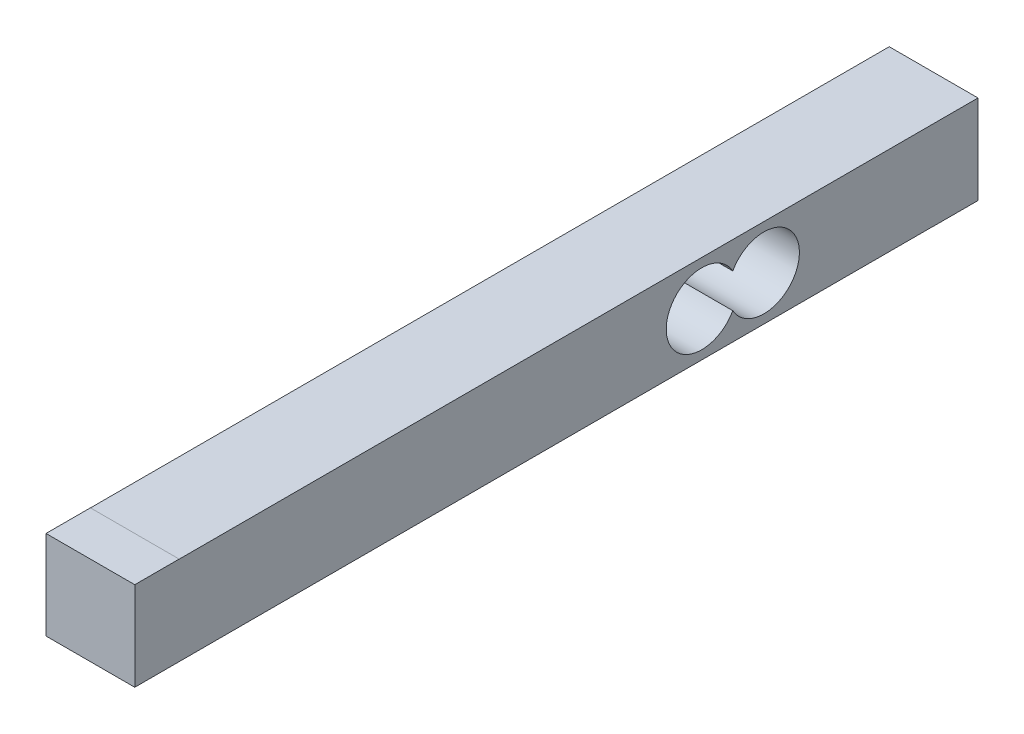
ISO-10303-21;
HEADER;
FILE_DESCRIPTION(('STEP AP214'),'2;1');
FILE_NAME('part.step','',(''),(''),'','','');
FILE_SCHEMA(('AUTOMOTIVE_DESIGN { 1 0 10303 214 1 1 1 1 }'));
ENDSEC;
DATA;
#1=APPLICATION_CONTEXT('core data for automotive mechanical design processes');
#2=APPLICATION_PROTOCOL_DEFINITION('international standard','automotive_design',2000,#1);
#3=PRODUCT_CONTEXT('',#1,'mechanical');
#4=PRODUCT('Part','Part','',(#3));
#5=PRODUCT_RELATED_PRODUCT_CATEGORY('part','',(#4));
#6=PRODUCT_DEFINITION_FORMATION('','',#4);
#7=PRODUCT_DEFINITION_CONTEXT('part definition',#1,'design');
#8=PRODUCT_DEFINITION('design','',#6,#7);
#9=PRODUCT_DEFINITION_SHAPE('','',#8);
#10=(LENGTH_UNIT() NAMED_UNIT(*) SI_UNIT(.MILLI.,.METRE.));
#11=(NAMED_UNIT(*) PLANE_ANGLE_UNIT() SI_UNIT($,.RADIAN.));
#12=(NAMED_UNIT(*) SI_UNIT($,.STERADIAN.) SOLID_ANGLE_UNIT());
#13=UNCERTAINTY_MEASURE_WITH_UNIT(LENGTH_MEASURE(1.E-05),#10,'distance_accuracy_value','');
#14=(GEOMETRIC_REPRESENTATION_CONTEXT(3) GLOBAL_UNCERTAINTY_ASSIGNED_CONTEXT((#13)) GLOBAL_UNIT_ASSIGNED_CONTEXT((#10,
#11,#12)) REPRESENTATION_CONTEXT('',''));
#15=CARTESIAN_POINT('',(0.,0.,0.));
#16=DIRECTION('',(0.,0.,1.));
#17=DIRECTION('',(1.,0.,0.));
#18=AXIS2_PLACEMENT_3D('',#15,#16,#17);
#19=CARTESIAN_POINT('',(-5.,-5.,95.));
#20=DIRECTION('',(0.,1.,0.));
#21=DIRECTION('',(0.,0.,1.));
#22=AXIS2_PLACEMENT_3D('',#19,#20,#21);
#23=PLANE('',#22);
#24=DIRECTION('',(-1.,0.,0.));
#25=VECTOR('',#24,1.);
#26=CARTESIAN_POINT('',(-5.,-5.,5.));
#27=LINE('',#26,#25);
#28=CARTESIAN_POINT('',(5.,-5.,5.));
#29=VERTEX_POINT('',#28);
#30=CARTESIAN_POINT('',(-5.,-5.,5.));
#31=VERTEX_POINT('',#30);
#32=EDGE_CURVE('E134',#29,#31,#27,.T.);
#33=ORIENTED_EDGE('',*,*,#32,.F.);
#34=DIRECTION('',(0.,0.,-1.));
#35=VECTOR('',#34,1.);
#36=CARTESIAN_POINT('',(5.,-5.,95.));
#37=LINE('',#36,#35);
#38=CARTESIAN_POINT('',(5.,-5.,95.));
#39=VERTEX_POINT('',#38);
#40=EDGE_CURVE('E48',#39,#29,#37,.T.);
#41=ORIENTED_EDGE('',*,*,#40,.F.);
#42=DIRECTION('',(1.,0.,0.));
#43=VECTOR('',#42,1.);
#44=CARTESIAN_POINT('',(-5.,-5.,95.));
#45=LINE('',#44,#43);
#46=CARTESIAN_POINT('',(-5.,-5.,95.));
#47=VERTEX_POINT('',#46);
#48=EDGE_CURVE('E188',#47,#39,#45,.T.);
#49=ORIENTED_EDGE('',*,*,#48,.F.);
#50=DIRECTION('',(0.,0.,-1.));
#51=VECTOR('',#50,1.);
#52=CARTESIAN_POINT('',(-5.,-5.,95.));
#53=LINE('',#52,#51);
#54=EDGE_CURVE('E11',#47,#31,#53,.T.);
#55=ORIENTED_EDGE('',*,*,#54,.T.);
#56=EDGE_LOOP('',(#33,#41,#49,#55));
#57=FACE_BOUND('',#56,.T.);
#58=ADVANCED_FACE('F39',(#57),#23,.F.);
#59=CARTESIAN_POINT('',(-5.,5.,95.));
#60=DIRECTION('',(0.,-1.,0.));
#61=DIRECTION('',(1.,0.,0.));
#62=AXIS2_PLACEMENT_3D('',#59,#60,#61);
#63=PLANE('',#62);
#64=DIRECTION('',(-1.,0.,0.));
#65=VECTOR('',#64,1.);
#66=CARTESIAN_POINT('',(-5.,5.,90.));
#67=LINE('',#66,#65);
#68=CARTESIAN_POINT('',(5.,5.,90.));
#69=VERTEX_POINT('',#68);
#70=CARTESIAN_POINT('',(-5.,5.,90.));
#71=VERTEX_POINT('',#70);
#72=EDGE_CURVE('E160',#69,#71,#67,.T.);
#73=ORIENTED_EDGE('',*,*,#72,.F.);
#74=DIRECTION('',(0.,0.,-1.));
#75=VECTOR('',#74,1.);
#76=CARTESIAN_POINT('',(5.,5.,95.));
#77=LINE('',#76,#75);
#78=CARTESIAN_POINT('',(5.,5.,0.));
#79=VERTEX_POINT('',#78);
#80=EDGE_CURVE('E175',#69,#79,#77,.T.);
#81=ORIENTED_EDGE('',*,*,#80,.T.);
#82=DIRECTION('',(-1.,0.,0.));
#83=VECTOR('',#82,1.);
#84=CARTESIAN_POINT('',(-5.,5.,0.));
#85=LINE('',#84,#83);
#86=CARTESIAN_POINT('',(-5.,5.,0.));
#87=VERTEX_POINT('',#86);
#88=EDGE_CURVE('E189',#79,#87,#85,.T.);
#89=ORIENTED_EDGE('',*,*,#88,.T.);
#90=DIRECTION('',(0.,0.,-1.));
#91=VECTOR('',#90,1.);
#92=CARTESIAN_POINT('',(-5.,5.,95.));
#93=LINE('',#92,#91);
#94=EDGE_CURVE('E193',#71,#87,#93,.T.);
#95=ORIENTED_EDGE('',*,*,#94,.F.);
#96=EDGE_LOOP('',(#73,#81,#89,#95));
#97=FACE_BOUND('',#96,.T.);
#98=ADVANCED_FACE('F242',(#97),#63,.F.);
#99=CARTESIAN_POINT('',(-5.,5.,95.));
#100=DIRECTION('',(1.,0.,0.));
#101=DIRECTION('',(0.,1.,0.));
#102=AXIS2_PLACEMENT_3D('',#99,#100,#101);
#103=PLANE('',#102);
#104=CARTESIAN_POINT('',(-5.,-0.00500000000000498,31.125));
#105=DIRECTION('',(1.,0.,0.));
#106=DIRECTION('',(0.,1.,0.));
#107=AXIS2_PLACEMENT_3D('',#104,#105,#106);
#108=CIRCLE('',#107,4.);
#109=CARTESIAN_POINT('',(-5.,1.9314916731037,27.625));
#110=VERTEX_POINT('',#109);
#111=CARTESIAN_POINT('',(-5.,-1.94149167310371,27.625));
#112=VERTEX_POINT('',#111);
#113=EDGE_CURVE('E119',#110,#112,#108,.T.);
#114=ORIENTED_EDGE('',*,*,#113,.T.);
#115=CARTESIAN_POINT('',(-5.,-0.00500000000000376,24.125));
#116=DIRECTION('',(1.,0.,0.));
#117=DIRECTION('',(0.,1.,0.));
#118=AXIS2_PLACEMENT_3D('',#115,#116,#117);
#119=CIRCLE('',#118,4.);
#120=EDGE_CURVE('E117',#112,#110,#119,.T.);
#121=ORIENTED_EDGE('',*,*,#120,.T.);
#122=EDGE_LOOP('',(#114,#121));
#123=FACE_BOUND('',#122,.T.);
#124=DIRECTION('',(0.,-1.,0.));
#125=VECTOR('',#124,1.);
#126=CARTESIAN_POINT('',(-5.,5.,0.));
#127=LINE('',#126,#125);
#128=CARTESIAN_POINT('',(-5.,-5.01,0.));
#129=VERTEX_POINT('',#128);
#130=EDGE_CURVE('E194',#87,#129,#127,.T.);
#131=ORIENTED_EDGE('',*,*,#130,.T.);
#132=DIRECTION('',(0.,0.,-1.));
#133=VECTOR('',#132,1.);
#134=CARTESIAN_POINT('',(-5.,-5.01,0.));
#135=LINE('',#134,#133);
#136=CARTESIAN_POINT('',(-5.,-5.01,5.));
#137=VERTEX_POINT('',#136);
#138=EDGE_CURVE('E135',#137,#129,#135,.T.);
#139=ORIENTED_EDGE('',*,*,#138,.F.);
#140=DIRECTION('',(0.,1.,0.));
#141=VECTOR('',#140,1.);
#142=CARTESIAN_POINT('',(-5.,-5.01,5.));
#143=LINE('',#142,#141);
#144=EDGE_CURVE('E145',#137,#31,#143,.T.);
#145=ORIENTED_EDGE('',*,*,#144,.T.);
#146=ORIENTED_EDGE('',*,*,#54,.F.);
#147=DIRECTION('',(0.,-1.,0.));
#148=VECTOR('',#147,1.);
#149=CARTESIAN_POINT('',(-5.,5.,95.));
#150=LINE('',#149,#148);
#151=CARTESIAN_POINT('',(-5.,5.01,95.));
#152=VERTEX_POINT('',#151);
#153=EDGE_CURVE('E185',#152,#47,#150,.T.);
#154=ORIENTED_EDGE('',*,*,#153,.F.);
#155=DIRECTION('',(0.,0.,1.));
#156=VECTOR('',#155,1.);
#157=CARTESIAN_POINT('',(-5.,5.01,95.));
#158=LINE('',#157,#156);
#159=CARTESIAN_POINT('',(-5.,5.01,90.));
#160=VERTEX_POINT('',#159);
#161=EDGE_CURVE('E148',#160,#152,#158,.T.);
#162=ORIENTED_EDGE('',*,*,#161,.F.);
#163=DIRECTION('',(0.,-1.,0.));
#164=VECTOR('',#163,1.);
#165=CARTESIAN_POINT('',(-5.,5.01,90.));
#166=LINE('',#165,#164);
#167=EDGE_CURVE('E178',#160,#71,#166,.T.);
#168=ORIENTED_EDGE('',*,*,#167,.T.);
#169=ORIENTED_EDGE('',*,*,#94,.T.);
#170=EDGE_LOOP('',(#131,#139,#145,#146,#154,#162,#168,#169));
#171=FACE_BOUND('',#170,.T.);
#172=ADVANCED_FACE('F41',(#123,#171),#103,.F.);
#173=CARTESIAN_POINT('',(5.,5.,95.));
#174=DIRECTION('',(-1.,0.,0.));
#175=DIRECTION('',(0.,-1.,0.));
#176=AXIS2_PLACEMENT_3D('',#173,#174,#175);
#177=PLANE('',#176);
#178=CARTESIAN_POINT('',(5.,-0.00500000000000361,31.125));
#179=DIRECTION('',(1.,0.,0.));
#180=DIRECTION('',(0.,1.,0.));
#181=AXIS2_PLACEMENT_3D('',#178,#179,#180);
#182=CIRCLE('',#181,4.);
#183=CARTESIAN_POINT('',(5.,1.93149167310371,27.625));
#184=VERTEX_POINT('',#183);
#185=CARTESIAN_POINT('',(5.,-1.94149167310371,27.625));
#186=VERTEX_POINT('',#185);
#187=EDGE_CURVE('E123',#184,#186,#182,.T.);
#188=ORIENTED_EDGE('',*,*,#187,.F.);
#189=CARTESIAN_POINT('',(5.,-0.0050000000000024,24.125));
#190=DIRECTION('',(1.,0.,0.));
#191=DIRECTION('',(0.,1.,0.));
#192=AXIS2_PLACEMENT_3D('',#189,#190,#191);
#193=CIRCLE('',#192,4.);
#194=EDGE_CURVE('E63',#186,#184,#193,.T.);
#195=ORIENTED_EDGE('',*,*,#194,.F.);
#196=EDGE_LOOP('',(#188,#195));
#197=FACE_BOUND('',#196,.T.);
#198=DIRECTION('',(0.,1.,0.));
#199=VECTOR('',#198,1.);
#200=CARTESIAN_POINT('',(5.,5.,0.));
#201=LINE('',#200,#199);
#202=CARTESIAN_POINT('',(5.,-5.01,0.));
#203=VERTEX_POINT('',#202);
#204=EDGE_CURVE('E196',#203,#79,#201,.T.);
#205=ORIENTED_EDGE('',*,*,#204,.T.);
#206=ORIENTED_EDGE('',*,*,#80,.F.);
#207=DIRECTION('',(0.,-1.,0.));
#208=VECTOR('',#207,1.);
#209=CARTESIAN_POINT('',(5.,5.01,90.));
#210=LINE('',#209,#208);
#211=CARTESIAN_POINT('',(5.,5.01,90.));
#212=VERTEX_POINT('',#211);
#213=EDGE_CURVE('E197',#212,#69,#210,.T.);
#214=ORIENTED_EDGE('',*,*,#213,.F.);
#215=DIRECTION('',(0.,0.,-1.));
#216=VECTOR('',#215,1.);
#217=CARTESIAN_POINT('',(5.,5.01,95.));
#218=LINE('',#217,#216);
#219=CARTESIAN_POINT('',(5.,5.01,95.));
#220=VERTEX_POINT('',#219);
#221=EDGE_CURVE('E216',#220,#212,#218,.T.);
#222=ORIENTED_EDGE('',*,*,#221,.F.);
#223=DIRECTION('',(0.,1.,0.));
#224=VECTOR('',#223,1.);
#225=CARTESIAN_POINT('',(5.,5.,95.));
#226=LINE('',#225,#224);
#227=EDGE_CURVE('E191',#39,#220,#226,.T.);
#228=ORIENTED_EDGE('',*,*,#227,.F.);
#229=ORIENTED_EDGE('',*,*,#40,.T.);
#230=DIRECTION('',(0.,1.,0.));
#231=VECTOR('',#230,1.);
#232=CARTESIAN_POINT('',(5.,-5.01,5.));
#233=LINE('',#232,#231);
#234=CARTESIAN_POINT('',(5.,-5.01,5.));
#235=VERTEX_POINT('',#234);
#236=EDGE_CURVE('E157',#235,#29,#233,.T.);
#237=ORIENTED_EDGE('',*,*,#236,.F.);
#238=DIRECTION('',(0.,0.,1.));
#239=VECTOR('',#238,1.);
#240=CARTESIAN_POINT('',(5.,-5.01,0.));
#241=LINE('',#240,#239);
#242=EDGE_CURVE('E141',#203,#235,#241,.T.);
#243=ORIENTED_EDGE('',*,*,#242,.F.);
#244=EDGE_LOOP('',(#205,#206,#214,#222,#228,#229,#237,#243));
#245=FACE_BOUND('',#244,.T.);
#246=ADVANCED_FACE('F127',(#197,#245),#177,.F.);
#247=CARTESIAN_POINT('',(0.,0.,95.));
#248=DIRECTION('',(0.,0.,1.));
#249=DIRECTION('',(1.,0.,0.));
#250=AXIS2_PLACEMENT_3D('',#247,#248,#249);
#251=PLANE('',#250);
#252=ORIENTED_EDGE('',*,*,#153,.T.);
#253=ORIENTED_EDGE('',*,*,#48,.T.);
#254=ORIENTED_EDGE('',*,*,#227,.T.);
#255=DIRECTION('',(1.,0.,0.));
#256=VECTOR('',#255,1.);
#257=CARTESIAN_POINT('',(-5.,5.01,95.));
#258=LINE('',#257,#256);
#259=EDGE_CURVE('E171',#152,#220,#258,.T.);
#260=ORIENTED_EDGE('',*,*,#259,.F.);
#261=EDGE_LOOP('',(#252,#253,#254,#260));
#262=FACE_BOUND('',#261,.T.);
#263=ADVANCED_FACE('F227',(#262),#251,.T.);
#264=CARTESIAN_POINT('',(0.,0.,0.));
#265=DIRECTION('',(0.,0.,1.));
#266=DIRECTION('',(1.,0.,0.));
#267=AXIS2_PLACEMENT_3D('',#264,#265,#266);
#268=PLANE('',#267);
#269=ORIENTED_EDGE('',*,*,#130,.F.);
#270=ORIENTED_EDGE('',*,*,#88,.F.);
#271=ORIENTED_EDGE('',*,*,#204,.F.);
#272=DIRECTION('',(1.,0.,0.));
#273=VECTOR('',#272,1.);
#274=CARTESIAN_POINT('',(-5.,-5.01,0.));
#275=LINE('',#274,#273);
#276=EDGE_CURVE('E138',#129,#203,#275,.T.);
#277=ORIENTED_EDGE('',*,*,#276,.F.);
#278=EDGE_LOOP('',(#269,#270,#271,#277));
#279=FACE_BOUND('',#278,.T.);
#280=ADVANCED_FACE('F239',(#279),#268,.F.);
#281=CARTESIAN_POINT('',(-5.,5.01,90.));
#282=DIRECTION('',(0.,0.,1.));
#283=DIRECTION('',(1.,0.,0.));
#284=AXIS2_PLACEMENT_3D('',#281,#282,#283);
#285=PLANE('',#284);
#286=ORIENTED_EDGE('',*,*,#72,.T.);
#287=ORIENTED_EDGE('',*,*,#167,.F.);
#288=DIRECTION('',(-1.,0.,0.));
#289=VECTOR('',#288,1.);
#290=CARTESIAN_POINT('',(-5.,5.01,90.));
#291=LINE('',#290,#289);
#292=EDGE_CURVE('E183',#212,#160,#291,.T.);
#293=ORIENTED_EDGE('',*,*,#292,.F.);
#294=ORIENTED_EDGE('',*,*,#213,.T.);
#295=EDGE_LOOP('',(#286,#287,#293,#294));
#296=FACE_BOUND('',#295,.T.);
#297=ADVANCED_FACE('F225',(#296),#285,.F.);
#298=CARTESIAN_POINT('',(0.,5.01,0.));
#299=DIRECTION('',(0.,-1.,0.));
#300=DIRECTION('',(0.,0.,-1.));
#301=AXIS2_PLACEMENT_3D('',#298,#299,#300);
#302=PLANE('',#301);
#303=ORIENTED_EDGE('',*,*,#161,.T.);
#304=ORIENTED_EDGE('',*,*,#259,.T.);
#305=ORIENTED_EDGE('',*,*,#221,.T.);
#306=ORIENTED_EDGE('',*,*,#292,.T.);
#307=EDGE_LOOP('',(#303,#304,#305,#306));
#308=FACE_BOUND('',#307,.T.);
#309=ADVANCED_FACE('F221',(#308),#302,.F.);
#310=CARTESIAN_POINT('',(-5.,-5.01,5.));
#311=DIRECTION('',(0.,0.,-1.));
#312=DIRECTION('',(-1.,0.,0.));
#313=AXIS2_PLACEMENT_3D('',#310,#311,#312);
#314=PLANE('',#313);
#315=ORIENTED_EDGE('',*,*,#32,.T.);
#316=ORIENTED_EDGE('',*,*,#144,.F.);
#317=DIRECTION('',(-1.,0.,0.));
#318=VECTOR('',#317,1.);
#319=CARTESIAN_POINT('',(-5.,-5.01,5.));
#320=LINE('',#319,#318);
#321=EDGE_CURVE('E143',#235,#137,#320,.T.);
#322=ORIENTED_EDGE('',*,*,#321,.F.);
#323=ORIENTED_EDGE('',*,*,#236,.T.);
#324=EDGE_LOOP('',(#315,#316,#322,#323));
#325=FACE_BOUND('',#324,.T.);
#326=ADVANCED_FACE('F232',(#325),#314,.F.);
#327=CARTESIAN_POINT('',(0.,-5.01,0.));
#328=DIRECTION('',(0.,1.,0.));
#329=DIRECTION('',(0.,0.,1.));
#330=AXIS2_PLACEMENT_3D('',#327,#328,#329);
#331=PLANE('',#330);
#332=ORIENTED_EDGE('',*,*,#138,.T.);
#333=ORIENTED_EDGE('',*,*,#276,.T.);
#334=ORIENTED_EDGE('',*,*,#242,.T.);
#335=ORIENTED_EDGE('',*,*,#321,.T.);
#336=EDGE_LOOP('',(#332,#333,#334,#335));
#337=FACE_BOUND('',#336,.T.);
#338=ADVANCED_FACE('F235',(#337),#331,.F.);
#339=CARTESIAN_POINT('',(-5.00005,-0.00500000000000376,24.125));
#340=DIRECTION('',(1.,0.,0.));
#341=DIRECTION('',(0.,1.,0.));
#342=AXIS2_PLACEMENT_3D('',#339,#340,#341);
#343=CYLINDRICAL_SURFACE('',#342,4.);
#344=DIRECTION('',(1.,0.,0.));
#345=VECTOR('',#344,1.);
#346=CARTESIAN_POINT('',(-5.00005,-1.94149167310372,27.625));
#347=LINE('',#346,#345);
#348=EDGE_CURVE('E56',#112,#186,#347,.T.);
#349=ORIENTED_EDGE('',*,*,#348,.T.);
#350=ORIENTED_EDGE('',*,*,#194,.T.);
#351=DIRECTION('',(1.,0.,0.));
#352=VECTOR('',#351,1.);
#353=CARTESIAN_POINT('',(-5.00005,1.9314916731037,27.625));
#354=LINE('',#353,#352);
#355=EDGE_CURVE('E120',#110,#184,#354,.T.);
#356=ORIENTED_EDGE('',*,*,#355,.F.);
#357=ORIENTED_EDGE('',*,*,#120,.F.);
#358=EDGE_LOOP('',(#349,#350,#356,#357));
#359=FACE_BOUND('',#358,.T.);
#360=ADVANCED_FACE('F115',(#359),#343,.F.);
#361=CARTESIAN_POINT('',(-5.00005,-0.00500000000000498,31.125));
#362=DIRECTION('',(1.,0.,0.));
#363=DIRECTION('',(0.,1.,0.));
#364=AXIS2_PLACEMENT_3D('',#361,#362,#363);
#365=CYLINDRICAL_SURFACE('',#364,4.);
#366=ORIENTED_EDGE('',*,*,#355,.T.);
#367=ORIENTED_EDGE('',*,*,#187,.T.);
#368=ORIENTED_EDGE('',*,*,#348,.F.);
#369=ORIENTED_EDGE('',*,*,#113,.F.);
#370=EDGE_LOOP('',(#366,#367,#368,#369));
#371=FACE_BOUND('',#370,.T.);
#372=ADVANCED_FACE('F124',(#371),#365,.F.);
#373=CLOSED_SHELL('',(#58,#98,#172,#246,#263,#280,#297,#309,#326,#338,#360,#372));
#374=MANIFOLD_SOLID_BREP('B2',#373);
#375=ADVANCED_BREP_SHAPE_REPRESENTATION('',(#18,#374),#14);
#376=SHAPE_DEFINITION_REPRESENTATION(#9,#375);
ENDSEC;
END-ISO-10303-21;
